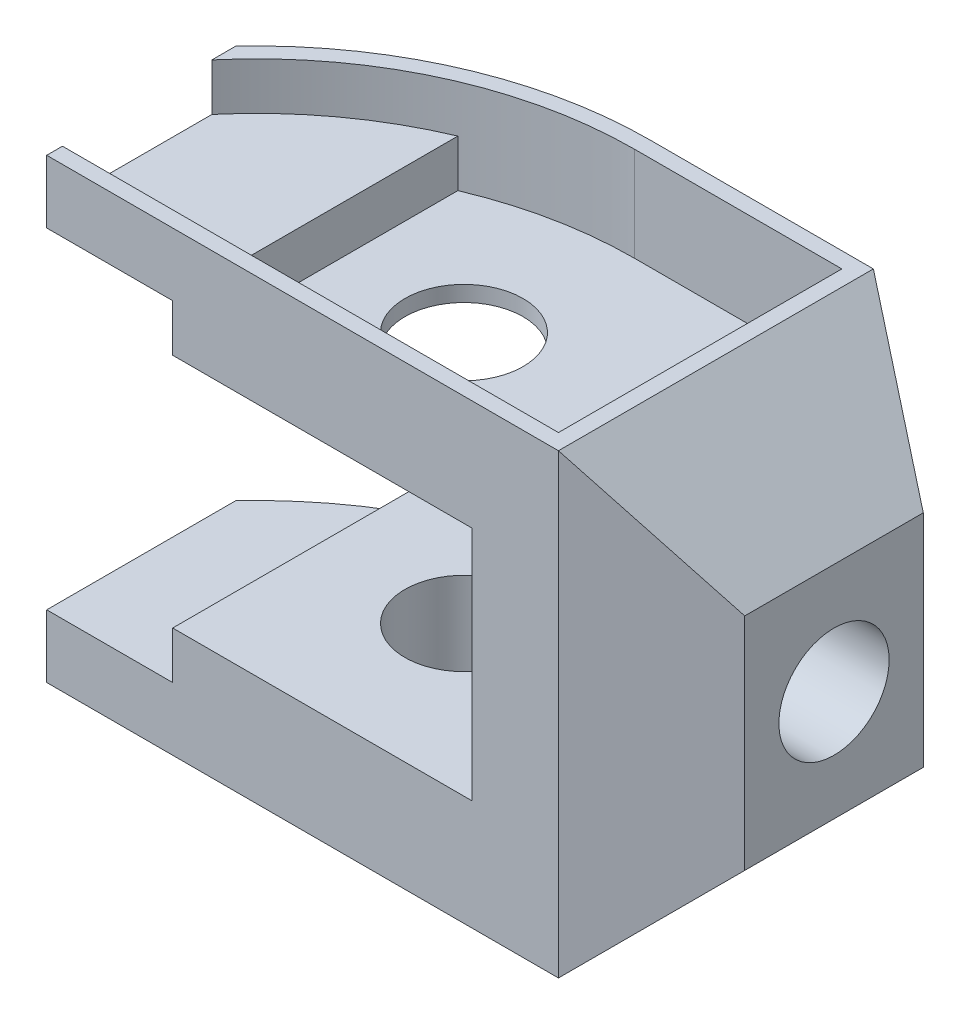
ISO-10303-21;
HEADER;
FILE_DESCRIPTION(('STEP AP214'),'2;1');
FILE_NAME('part.step','',(''),(''),'','','');
FILE_SCHEMA(('AUTOMOTIVE_DESIGN { 1 0 10303 214 1 1 1 1 }'));
ENDSEC;
DATA;
#1=APPLICATION_CONTEXT('core data for automotive mechanical design processes');
#2=APPLICATION_PROTOCOL_DEFINITION('international standard','automotive_design',2000,#1);
#3=PRODUCT_CONTEXT('',#1,'mechanical');
#4=PRODUCT('Part','Part','',(#3));
#5=PRODUCT_RELATED_PRODUCT_CATEGORY('part','',(#4));
#6=PRODUCT_DEFINITION_FORMATION('','',#4);
#7=PRODUCT_DEFINITION_CONTEXT('part definition',#1,'design');
#8=PRODUCT_DEFINITION('design','',#6,#7);
#9=PRODUCT_DEFINITION_SHAPE('','',#8);
#10=(LENGTH_UNIT() NAMED_UNIT(*) SI_UNIT(.MILLI.,.METRE.));
#11=(NAMED_UNIT(*) PLANE_ANGLE_UNIT() SI_UNIT($,.RADIAN.));
#12=(NAMED_UNIT(*) SI_UNIT($,.STERADIAN.) SOLID_ANGLE_UNIT());
#13=UNCERTAINTY_MEASURE_WITH_UNIT(LENGTH_MEASURE(1.E-05),#10,'distance_accuracy_value','');
#14=(GEOMETRIC_REPRESENTATION_CONTEXT(3) GLOBAL_UNCERTAINTY_ASSIGNED_CONTEXT((#13)) GLOBAL_UNIT_ASSIGNED_CONTEXT((#10,
#11,#12)) REPRESENTATION_CONTEXT('',''));
#15=CARTESIAN_POINT('',(0.,0.,0.));
#16=DIRECTION('',(0.,0.,1.));
#17=DIRECTION('',(1.,0.,0.));
#18=AXIS2_PLACEMENT_3D('',#15,#16,#17);
#19=CARTESIAN_POINT('',(34.,58.,-19.));
#20=DIRECTION('',(0.,-1.,0.));
#21=DIRECTION('',(0.,0.,-1.));
#22=AXIS2_PLACEMENT_3D('',#19,#20,#21);
#23=CYLINDRICAL_SURFACE('',#22,7.5);
#24=CARTESIAN_POINT('',(34.,44.,-19.));
#25=DIRECTION('',(0.,1.,0.));
#26=DIRECTION('',(0.,0.,1.));
#27=AXIS2_PLACEMENT_3D('',#24,#25,#26);
#28=CIRCLE('',#27,7.5);
#29=CARTESIAN_POINT('',(34.,44.,-26.5));
#30=VERTEX_POINT('',#29);
#31=EDGE_CURVE('E321',#30,#30,#28,.T.);
#32=CARTESIAN_POINT('',(34.,46.,-19.));
#33=DIRECTION('',(0.,1.,0.));
#34=DIRECTION('',(0.,0.,1.));
#35=AXIS2_PLACEMENT_3D('',#32,#33,#34);
#36=CIRCLE('',#35,7.5);
#37=CARTESIAN_POINT('',(34.,46.,-26.5));
#38=VERTEX_POINT('',#37);
#39=EDGE_CURVE('E50',#38,#38,#36,.T.);
#40=CARTESIAN_POINT('',(34.,44.,-26.5));
#41=CARTESIAN_POINT('',(34.,44.0208333333333,-26.5));
#42=CARTESIAN_POINT('',(34.,44.0416666666667,-26.5));
#43=CARTESIAN_POINT('',(34.,44.0833333333333,-26.5));
#44=CARTESIAN_POINT('',(34.,44.1041666666667,-26.5));
#45=CARTESIAN_POINT('',(34.,44.1458333333333,-26.5));
#46=CARTESIAN_POINT('',(34.,44.1666666666667,-26.5));
#47=CARTESIAN_POINT('',(34.,44.2083333333333,-26.5));
#48=CARTESIAN_POINT('',(34.,44.2291666666667,-26.5));
#49=CARTESIAN_POINT('',(34.,44.2708333333333,-26.5));
#50=CARTESIAN_POINT('',(34.,44.2916666666667,-26.5));
#51=CARTESIAN_POINT('',(34.,44.3333333333333,-26.5));
#52=CARTESIAN_POINT('',(34.,44.3541666666667,-26.5));
#53=CARTESIAN_POINT('',(34.,44.3958333333333,-26.5));
#54=CARTESIAN_POINT('',(34.,44.4166666666667,-26.5));
#55=CARTESIAN_POINT('',(34.,44.4583333333333,-26.5));
#56=CARTESIAN_POINT('',(34.,44.4791666666667,-26.5));
#57=CARTESIAN_POINT('',(34.,44.5208333333333,-26.5));
#58=CARTESIAN_POINT('',(34.,44.5416666666667,-26.5));
#59=CARTESIAN_POINT('',(34.,44.5833333333333,-26.5));
#60=CARTESIAN_POINT('',(34.,44.6041666666667,-26.5));
#61=CARTESIAN_POINT('',(34.,44.6458333333333,-26.5));
#62=CARTESIAN_POINT('',(34.,44.6666666666667,-26.5));
#63=CARTESIAN_POINT('',(34.,44.7083333333333,-26.5));
#64=CARTESIAN_POINT('',(34.,44.7291666666667,-26.5));
#65=CARTESIAN_POINT('',(34.,44.7708333333333,-26.5));
#66=CARTESIAN_POINT('',(34.,44.7916666666667,-26.5));
#67=CARTESIAN_POINT('',(34.,44.8333333333333,-26.5));
#68=CARTESIAN_POINT('',(34.,44.8541666666667,-26.5));
#69=CARTESIAN_POINT('',(34.,44.8958333333333,-26.5));
#70=CARTESIAN_POINT('',(34.,44.9166666666667,-26.5));
#71=CARTESIAN_POINT('',(34.,44.9583333333333,-26.5));
#72=CARTESIAN_POINT('',(34.,44.9791666666667,-26.5));
#73=CARTESIAN_POINT('',(34.,45.0208333333333,-26.5));
#74=CARTESIAN_POINT('',(34.,45.0416666666667,-26.5));
#75=CARTESIAN_POINT('',(34.,45.0833333333333,-26.5));
#76=CARTESIAN_POINT('',(34.,45.1041666666667,-26.5));
#77=CARTESIAN_POINT('',(34.,45.1458333333333,-26.5));
#78=CARTESIAN_POINT('',(34.,45.1666666666667,-26.5));
#79=CARTESIAN_POINT('',(34.,45.2083333333333,-26.5));
#80=CARTESIAN_POINT('',(34.,45.2291666666667,-26.5));
#81=CARTESIAN_POINT('',(34.,45.2708333333333,-26.5));
#82=CARTESIAN_POINT('',(34.,45.2916666666667,-26.5));
#83=CARTESIAN_POINT('',(34.,45.3333333333333,-26.5));
#84=CARTESIAN_POINT('',(34.,45.3541666666667,-26.5));
#85=CARTESIAN_POINT('',(34.,45.3958333333333,-26.5));
#86=CARTESIAN_POINT('',(34.,45.4166666666667,-26.5));
#87=CARTESIAN_POINT('',(34.,45.4583333333333,-26.5));
#88=CARTESIAN_POINT('',(34.,45.4791666666667,-26.5));
#89=CARTESIAN_POINT('',(34.,45.5208333333333,-26.5));
#90=CARTESIAN_POINT('',(34.,45.5416666666667,-26.5));
#91=CARTESIAN_POINT('',(34.,45.5833333333333,-26.5));
#92=CARTESIAN_POINT('',(34.,45.6041666666667,-26.5));
#93=CARTESIAN_POINT('',(34.,45.6458333333333,-26.5));
#94=CARTESIAN_POINT('',(34.,45.6666666666667,-26.5));
#95=CARTESIAN_POINT('',(34.,45.7083333333333,-26.5));
#96=CARTESIAN_POINT('',(34.,45.7291666666667,-26.5));
#97=CARTESIAN_POINT('',(34.,45.7708333333333,-26.5));
#98=CARTESIAN_POINT('',(34.,45.7916666666667,-26.5));
#99=CARTESIAN_POINT('',(34.,45.8333333333333,-26.5));
#100=CARTESIAN_POINT('',(34.,45.8541666666667,-26.5));
#101=CARTESIAN_POINT('',(34.,45.8958333333333,-26.5));
#102=CARTESIAN_POINT('',(34.,45.9166666666667,-26.5));
#103=CARTESIAN_POINT('',(34.,45.9583333333333,-26.5));
#104=CARTESIAN_POINT('',(34.,45.9791666666667,-26.5));
#105=CARTESIAN_POINT('',(34.,46.,-26.5));
#106=B_SPLINE_CURVE_WITH_KNOTS('',3,(#40,#41,#42,#43,#44,#45,#46,#47,#48,#49,#50,#51,#52,#53,
#54,#55,#56,#57,#58,#59,#60,#61,#62,#63,#64,#65,#66,#67,#68,#69,#70,#71,#72,#73,#74,#75,#76,#77,
#78,#79,#80,#81,#82,#83,#84,#85,#86,#87,#88,#89,#90,#91,#92,#93,#94,#95,#96,#97,#98,#99,#100,
#101,#102,#103,#104,#105),.UNSPECIFIED.,.F.,.F.,(4,2,2,2,2,2,2,2,2,2,2,2,2,2,2,2,2,2,2,2,2,2,2,
2,2,2,2,2,2,2,2,2,4),(0.,0.0625000000000001,0.125,0.1875,0.25,0.3125,0.375,0.4375,0.5,0.5625,
0.625000000000001,0.687500000000001,0.750000000000001,0.812500000000001,0.875000000000001,
0.937500000000001,1.,1.0625,1.125,1.1875,1.25,1.3125,1.375,1.4375,1.5,1.5625,1.625,1.6875,1.75,
1.8125,1.875,1.9375,2.),.UNSPECIFIED.);
#107=EDGE_CURVE('BSEAM46',#30,#38,#106,.T.);
#108=ORIENTED_EDGE('',*,*,#31,.F.);
#109=ORIENTED_EDGE('',*,*,#39,.T.);
#110=ORIENTED_EDGE('',*,*,#107,.T.);
#111=ORIENTED_EDGE('',*,*,#107,.F.);
#112=EDGE_LOOP('',(#108,#110,#109,#111));
#113=FACE_BOUND('',#112,.T.);
#114=ADVANCED_FACE('F46',(#113),#23,.F.);
#115=CARTESIAN_POINT('',(0.,58.,0.));
#116=DIRECTION('',(1.,0.,0.));
#117=DIRECTION('',(0.,0.,-1.));
#118=AXIS2_PLACEMENT_3D('',#115,#116,#117);
#119=PLANE('',#118);
#120=DIRECTION('',(0.,0.,1.));
#121=VECTOR('',#120,1.);
#122=CARTESIAN_POINT('',(0.,58.,0.));
#123=LINE('',#122,#121);
#124=CARTESIAN_POINT('',(0.,58.,-2.));
#125=VERTEX_POINT('',#124);
#126=CARTESIAN_POINT('',(0.,58.,0.));
#127=VERTEX_POINT('',#126);
#128=EDGE_CURVE('E333',#125,#127,#123,.T.);
#129=ORIENTED_EDGE('',*,*,#128,.F.);
#130=DIRECTION('',(0.,1.,0.));
#131=VECTOR('',#130,1.);
#132=CARTESIAN_POINT('',(0.,-22.5603197346869,-2.));
#133=LINE('',#132,#131);
#134=CARTESIAN_POINT('',(0.,52.,-2.));
#135=VERTEX_POINT('',#134);
#136=EDGE_CURVE('E226',#135,#125,#133,.T.);
#137=ORIENTED_EDGE('',*,*,#136,.F.);
#138=DIRECTION('',(0.,0.,-1.));
#139=VECTOR('',#138,1.);
#140=CARTESIAN_POINT('',(0.,52.,-2.));
#141=LINE('',#140,#139);
#142=CARTESIAN_POINT('',(0.,52.,-20.9838667696593));
#143=VERTEX_POINT('',#142);
#144=EDGE_CURVE('E225',#135,#143,#141,.T.);
#145=ORIENTED_EDGE('',*,*,#144,.T.);
#146=DIRECTION('',(0.,1.,0.));
#147=VECTOR('',#146,1.);
#148=CARTESIAN_POINT('',(0.,-22.5603197346869,-20.9838667696594));
#149=LINE('',#148,#147);
#150=CARTESIAN_POINT('',(0.,58.,-20.9838667696594));
#151=VERTEX_POINT('',#150);
#152=EDGE_CURVE('E223',#143,#151,#149,.T.);
#153=ORIENTED_EDGE('',*,*,#152,.T.);
#154=CARTESIAN_POINT('',(0.,58.,-24.));
#155=VERTEX_POINT('',#154);
#156=EDGE_CURVE('E329',#155,#151,#123,.T.);
#157=ORIENTED_EDGE('',*,*,#156,.F.);
#158=DIRECTION('',(0.,-1.,0.));
#159=VECTOR('',#158,1.);
#160=CARTESIAN_POINT('',(0.,58.,-24.));
#161=LINE('',#160,#159);
#162=CARTESIAN_POINT('',(0.,50.,-24.));
#163=VERTEX_POINT('',#162);
#164=EDGE_CURVE('E352',#155,#163,#161,.T.);
#165=ORIENTED_EDGE('',*,*,#164,.T.);
#166=DIRECTION('',(0.,0.,1.));
#167=VECTOR('',#166,1.);
#168=CARTESIAN_POINT('',(0.,50.,-40.));
#169=LINE('',#168,#167);
#170=CARTESIAN_POINT('',(0.,50.,0.));
#171=VERTEX_POINT('',#170);
#172=EDGE_CURVE('E301',#163,#171,#169,.T.);
#173=ORIENTED_EDGE('',*,*,#172,.T.);
#174=DIRECTION('',(0.,-1.,0.));
#175=VECTOR('',#174,1.);
#176=CARTESIAN_POINT('',(0.,58.,0.));
#177=LINE('',#176,#175);
#178=EDGE_CURVE('E372',#127,#171,#177,.T.);
#179=ORIENTED_EDGE('',*,*,#178,.F.);
#180=EDGE_LOOP('',(#129,#137,#145,#153,#157,#165,#173,#179));
#181=FACE_BOUND('',#180,.T.);
#182=ADVANCED_FACE('F415',(#181),#119,.F.);
#183=CARTESIAN_POINT('',(36.6606055596467,58.,10.));
#184=DIRECTION('',(0.,-1.,0.));
#185=DIRECTION('',(0.,0.,-1.));
#186=AXIS2_PLACEMENT_3D('',#183,#184,#185);
#187=CYLINDRICAL_SURFACE('',#186,50.);
#188=DIRECTION('',(0.,-1.,0.));
#189=VECTOR('',#188,1.);
#190=CARTESIAN_POINT('',(16.,58.,-35.5317403347236));
#191=LINE('',#190,#189);
#192=CARTESIAN_POINT('',(16.,44.,-35.5317403347236));
#193=VERTEX_POINT('',#192);
#194=CARTESIAN_POINT('',(16.,50.,-35.5317403347236));
#195=VERTEX_POINT('',#194);
#196=EDGE_CURVE('E385',#193,#195,#191,.F.);
#197=ORIENTED_EDGE('',*,*,#196,.T.);
#198=CARTESIAN_POINT('',(36.6606055596467,50.,10.));
#199=DIRECTION('',(0.,1.,0.));
#200=DIRECTION('',(0.,0.,1.));
#201=AXIS2_PLACEMENT_3D('',#198,#199,#200);
#202=CIRCLE('',#201,50.);
#203=EDGE_CURVE('E388',#195,#163,#202,.T.);
#204=ORIENTED_EDGE('',*,*,#203,.T.);
#205=ORIENTED_EDGE('',*,*,#164,.F.);
#206=CARTESIAN_POINT('',(36.6606055596467,58.,10.));
#207=DIRECTION('',(0.,1.,0.));
#208=DIRECTION('',(0.,0.,-1.));
#209=AXIS2_PLACEMENT_3D('',#206,#207,#208);
#210=CIRCLE('',#209,50.);
#211=CARTESIAN_POINT('',(36.6606055596467,58.,-40.));
#212=VERTEX_POINT('',#211);
#213=EDGE_CURVE('E338',#212,#155,#210,.T.);
#214=ORIENTED_EDGE('',*,*,#213,.F.);
#215=DIRECTION('',(0.,-1.,0.));
#216=VECTOR('',#215,1.);
#217=CARTESIAN_POINT('',(36.6606055596467,58.,-40.));
#218=LINE('',#217,#216);
#219=CARTESIAN_POINT('',(36.6606055596467,44.,-40.));
#220=VERTEX_POINT('',#219);
#221=EDGE_CURVE('E356',#212,#220,#218,.T.);
#222=ORIENTED_EDGE('',*,*,#221,.T.);
#223=CARTESIAN_POINT('',(36.6606055596467,44.,10.));
#224=DIRECTION('',(0.,1.,0.));
#225=DIRECTION('',(0.,0.,1.));
#226=AXIS2_PLACEMENT_3D('',#223,#224,#225);
#227=CIRCLE('',#226,50.);
#228=EDGE_CURVE('E322',#220,#193,#227,.T.);
#229=ORIENTED_EDGE('',*,*,#228,.T.);
#230=EDGE_LOOP('',(#197,#204,#205,#214,#222,#229));
#231=FACE_BOUND('',#230,.T.);
#232=ADVANCED_FACE('F422',(#231),#187,.T.);
#233=CARTESIAN_POINT('',(36.6606055596467,58.,10.));
#234=DIRECTION('',(0.,-1.,0.));
#235=DIRECTION('',(0.,0.,-1.));
#236=AXIS2_PLACEMENT_3D('',#233,#234,#235);
#237=PLANE('',#236);
#238=DIRECTION('',(0.,0.,-1.));
#239=VECTOR('',#238,1.);
#240=CARTESIAN_POINT('',(63.,58.,-2.));
#241=LINE('',#240,#239);
#242=CARTESIAN_POINT('',(63.,58.,-2.));
#243=VERTEX_POINT('',#242);
#244=CARTESIAN_POINT('',(63.,58.,-38.));
#245=VERTEX_POINT('',#244);
#246=EDGE_CURVE('E237',#243,#245,#241,.T.);
#247=ORIENTED_EDGE('',*,*,#246,.F.);
#248=DIRECTION('',(1.,0.,0.));
#249=VECTOR('',#248,1.);
#250=CARTESIAN_POINT('',(0.,58.,-2.));
#251=LINE('',#250,#249);
#252=EDGE_CURVE('E71',#125,#243,#251,.T.);
#253=ORIENTED_EDGE('',*,*,#252,.F.);
#254=ORIENTED_EDGE('',*,*,#128,.T.);
#255=DIRECTION('',(1.,0.,0.));
#256=VECTOR('',#255,1.);
#257=CARTESIAN_POINT('',(0.,58.,0.));
#258=LINE('',#257,#256);
#259=CARTESIAN_POINT('',(65.,58.,0.));
#260=VERTEX_POINT('',#259);
#261=EDGE_CURVE('E332',#127,#260,#258,.T.);
#262=ORIENTED_EDGE('',*,*,#261,.T.);
#263=DIRECTION('',(0.,0.,1.));
#264=VECTOR('',#263,1.);
#265=CARTESIAN_POINT('',(65.,58.,-40.));
#266=LINE('',#265,#264);
#267=CARTESIAN_POINT('',(65.,58.,-40.));
#268=VERTEX_POINT('',#267);
#269=EDGE_CURVE('E259',#268,#260,#266,.T.);
#270=ORIENTED_EDGE('',*,*,#269,.F.);
#271=DIRECTION('',(-1.,0.,0.));
#272=VECTOR('',#271,1.);
#273=CARTESIAN_POINT('',(65.,58.,-40.));
#274=LINE('',#273,#272);
#275=EDGE_CURVE('E336',#268,#212,#274,.T.);
#276=ORIENTED_EDGE('',*,*,#275,.T.);
#277=ORIENTED_EDGE('',*,*,#213,.T.);
#278=ORIENTED_EDGE('',*,*,#156,.T.);
#279=CARTESIAN_POINT('',(36.6606055596467,58.,10.));
#280=DIRECTION('',(0.,1.,0.));
#281=DIRECTION('',(0.,0.,1.));
#282=AXIS2_PLACEMENT_3D('',#279,#280,#281);
#283=CIRCLE('',#282,48.);
#284=CARTESIAN_POINT('',(36.6606055596467,58.,-38.));
#285=VERTEX_POINT('',#284);
#286=EDGE_CURVE('E243',#285,#151,#283,.T.);
#287=ORIENTED_EDGE('',*,*,#286,.F.);
#288=DIRECTION('',(-1.,0.,0.));
#289=VECTOR('',#288,1.);
#290=CARTESIAN_POINT('',(63.,58.,-38.));
#291=LINE('',#290,#289);
#292=EDGE_CURVE('E240',#245,#285,#291,.T.);
#293=ORIENTED_EDGE('',*,*,#292,.F.);
#294=EDGE_LOOP('',(#247,#253,#254,#262,#270,#276,#277,#278,#287,#293));
#295=FACE_BOUND('',#294,.T.);
#296=ADVANCED_FACE('F448',(#295),#237,.F.);
#297=CARTESIAN_POINT('',(36.6606055596467,0.,10.));
#298=DIRECTION('',(0.,-1.,0.));
#299=DIRECTION('',(0.,0.,-1.));
#300=AXIS2_PLACEMENT_3D('',#297,#298,#299);
#301=PLANE('',#300);
#302=DIRECTION('',(0.,0.,1.));
#303=VECTOR('',#302,1.);
#304=CARTESIAN_POINT('',(65.,0.,-40.));
#305=LINE('',#304,#303);
#306=CARTESIAN_POINT('',(65.,0.,-40.));
#307=VERTEX_POINT('',#306);
#308=CARTESIAN_POINT('',(65.,0.,0.));
#309=VERTEX_POINT('',#308);
#310=EDGE_CURVE('E261',#307,#309,#305,.T.);
#311=ORIENTED_EDGE('',*,*,#310,.T.);
#312=DIRECTION('',(1.,0.,0.));
#313=VECTOR('',#312,1.);
#314=CARTESIAN_POINT('',(0.,0.,0.));
#315=LINE('',#314,#313);
#316=CARTESIAN_POINT('',(0.,0.,0.));
#317=VERTEX_POINT('',#316);
#318=EDGE_CURVE('E343',#317,#309,#315,.T.);
#319=ORIENTED_EDGE('',*,*,#318,.F.);
#320=DIRECTION('',(0.,0.,1.));
#321=VECTOR('',#320,1.);
#322=CARTESIAN_POINT('',(0.,0.,0.));
#323=LINE('',#322,#321);
#324=CARTESIAN_POINT('',(0.,0.,-24.));
#325=VERTEX_POINT('',#324);
#326=EDGE_CURVE('E328',#325,#317,#323,.T.);
#327=ORIENTED_EDGE('',*,*,#326,.F.);
#328=CARTESIAN_POINT('',(36.6606055596467,0.,10.));
#329=DIRECTION('',(0.,1.,0.));
#330=DIRECTION('',(0.,0.,-1.));
#331=AXIS2_PLACEMENT_3D('',#328,#329,#330);
#332=CIRCLE('',#331,50.);
#333=CARTESIAN_POINT('',(36.6606055596467,0.,-40.));
#334=VERTEX_POINT('',#333);
#335=EDGE_CURVE('E349',#334,#325,#332,.T.);
#336=ORIENTED_EDGE('',*,*,#335,.F.);
#337=DIRECTION('',(-1.,0.,0.));
#338=VECTOR('',#337,1.);
#339=CARTESIAN_POINT('',(65.,0.,-40.));
#340=LINE('',#339,#338);
#341=EDGE_CURVE('E346',#307,#334,#340,.T.);
#342=ORIENTED_EDGE('',*,*,#341,.F.);
#343=EDGE_LOOP('',(#311,#319,#327,#336,#342));
#344=FACE_BOUND('',#343,.T.);
#345=CARTESIAN_POINT('',(34.,0.,-19.));
#346=DIRECTION('',(0.,1.,0.));
#347=DIRECTION('',(0.,0.,1.));
#348=AXIS2_PLACEMENT_3D('',#345,#346,#347);
#349=CIRCLE('',#348,7.5);
#350=CARTESIAN_POINT('',(34.,0.,-26.5));
#351=VERTEX_POINT('',#350);
#352=EDGE_CURVE('E325',#351,#351,#349,.T.);
#353=ORIENTED_EDGE('',*,*,#352,.T.);
#354=EDGE_LOOP('',(#353));
#355=FACE_BOUND('',#354,.T.);
#356=ADVANCED_FACE('F446',(#344,#355),#301,.T.);
#357=CARTESIAN_POINT('',(0.,8.,0.));
#358=VERTEX_POINT('',#357);
#359=EDGE_CURVE('E371',#358,#317,#177,.T.);
#360=ORIENTED_EDGE('',*,*,#359,.F.);
#361=DIRECTION('',(0.,0.,1.));
#362=VECTOR('',#361,1.);
#363=CARTESIAN_POINT('',(0.,8.,-40.));
#364=LINE('',#363,#362);
#365=CARTESIAN_POINT('',(0.,8.,-24.));
#366=VERTEX_POINT('',#365);
#367=EDGE_CURVE('E282',#366,#358,#364,.T.);
#368=ORIENTED_EDGE('',*,*,#367,.F.);
#369=EDGE_CURVE('E340',#366,#325,#161,.T.);
#370=ORIENTED_EDGE('',*,*,#369,.T.);
#371=ORIENTED_EDGE('',*,*,#326,.T.);
#372=EDGE_LOOP('',(#360,#368,#370,#371));
#373=FACE_BOUND('',#372,.T.);
#374=ADVANCED_FACE('F48',(#373),#119,.F.);
#375=CARTESIAN_POINT('',(0.,58.,0.));
#376=DIRECTION('',(0.,0.,-1.));
#377=DIRECTION('',(-1.,0.,0.));
#378=AXIS2_PLACEMENT_3D('',#375,#376,#377);
#379=PLANE('',#378);
#380=ORIENTED_EDGE('',*,*,#178,.T.);
#381=DIRECTION('',(-1.,0.,0.));
#382=VECTOR('',#381,1.);
#383=CARTESIAN_POINT('',(0.,50.,0.));
#384=LINE('',#383,#382);
#385=CARTESIAN_POINT('',(16.,50.,0.));
#386=VERTEX_POINT('',#385);
#387=EDGE_CURVE('E276',#386,#171,#384,.T.);
#388=ORIENTED_EDGE('',*,*,#387,.F.);
#389=DIRECTION('',(0.,1.,0.));
#390=VECTOR('',#389,1.);
#391=CARTESIAN_POINT('',(16.,50.,0.));
#392=LINE('',#391,#390);
#393=CARTESIAN_POINT('',(16.,44.,0.));
#394=VERTEX_POINT('',#393);
#395=EDGE_CURVE('E297',#394,#386,#392,.T.);
#396=ORIENTED_EDGE('',*,*,#395,.F.);
#397=DIRECTION('',(-1.,0.,0.));
#398=VECTOR('',#397,1.);
#399=CARTESIAN_POINT('',(16.,44.,0.));
#400=LINE('',#399,#398);
#401=CARTESIAN_POINT('',(54.,44.,0.));
#402=VERTEX_POINT('',#401);
#403=EDGE_CURVE('E294',#402,#394,#400,.T.);
#404=ORIENTED_EDGE('',*,*,#403,.F.);
#405=DIRECTION('',(0.,1.,0.));
#406=VECTOR('',#405,1.);
#407=CARTESIAN_POINT('',(54.,44.,0.));
#408=LINE('',#407,#406);
#409=CARTESIAN_POINT('',(54.,14.,0.));
#410=VERTEX_POINT('',#409);
#411=EDGE_CURVE('E291',#410,#402,#408,.T.);
#412=ORIENTED_EDGE('',*,*,#411,.F.);
#413=DIRECTION('',(1.,0.,0.));
#414=VECTOR('',#413,1.);
#415=CARTESIAN_POINT('',(54.,14.,0.));
#416=LINE('',#415,#414);
#417=CARTESIAN_POINT('',(16.,14.,0.));
#418=VERTEX_POINT('',#417);
#419=EDGE_CURVE('E288',#418,#410,#416,.T.);
#420=ORIENTED_EDGE('',*,*,#419,.F.);
#421=DIRECTION('',(0.,1.,0.));
#422=VECTOR('',#421,1.);
#423=CARTESIAN_POINT('',(16.,14.,0.));
#424=LINE('',#423,#422);
#425=CARTESIAN_POINT('',(16.,8.,0.));
#426=VERTEX_POINT('',#425);
#427=EDGE_CURVE('E285',#426,#418,#424,.T.);
#428=ORIENTED_EDGE('',*,*,#427,.F.);
#429=DIRECTION('',(1.,0.,0.));
#430=VECTOR('',#429,1.);
#431=CARTESIAN_POINT('',(16.,8.,0.));
#432=LINE('',#431,#430);
#433=EDGE_CURVE('E271',#358,#426,#432,.T.);
#434=ORIENTED_EDGE('',*,*,#433,.F.);
#435=ORIENTED_EDGE('',*,*,#359,.T.);
#436=ORIENTED_EDGE('',*,*,#318,.T.);
#437=DIRECTION('',(0.,-1.,0.));
#438=VECTOR('',#437,1.);
#439=CARTESIAN_POINT('',(65.,58.,0.));
#440=LINE('',#439,#438);
#441=EDGE_CURVE('E368',#260,#309,#440,.T.);
#442=ORIENTED_EDGE('',*,*,#441,.F.);
#443=ORIENTED_EDGE('',*,*,#261,.F.);
#444=EDGE_LOOP('',(#380,#388,#396,#404,#412,#420,#428,#434,#435,#436,#442,#443));
#445=FACE_BOUND('',#444,.T.);
#446=ADVANCED_FACE('F456',(#445),#379,.F.);
#447=CARTESIAN_POINT('',(65.,58.,0.));
#448=DIRECTION('',(-0.500000000000001,0.,-0.866025403784438));
#449=DIRECTION('',(-0.866025403784438,0.,0.500000000000001));
#450=AXIS2_PLACEMENT_3D('',#447,#448,#449);
#451=PLANE('',#450);
#452=DIRECTION('',(0.,-1.,0.));
#453=VECTOR('',#452,1.);
#454=CARTESIAN_POINT('',(80.,58.,-8.66025403784441));
#455=LINE('',#454,#453);
#456=CARTESIAN_POINT('',(80.,43.0000000000002,-8.66025403784441));
#457=VERTEX_POINT('',#456);
#458=CARTESIAN_POINT('',(80.,14.9999999999998,-8.66025403784441));
#459=VERTEX_POINT('',#458);
#460=EDGE_CURVE('E365',#457,#459,#455,.T.);
#461=ORIENTED_EDGE('',*,*,#460,.F.);
#462=DIRECTION('',(-0.65465367070798,0.654653670707973,0.37796447300923));
#463=VECTOR('',#462,1.);
#464=CARTESIAN_POINT('',(65.,58.,0.));
#465=LINE('',#464,#463);
#466=EDGE_CURVE('E268',#457,#260,#465,.T.);
#467=ORIENTED_EDGE('',*,*,#466,.T.);
#468=ORIENTED_EDGE('',*,*,#441,.T.);
#469=DIRECTION('',(0.65465367070798,0.654653670707973,-0.37796447300923));
#470=VECTOR('',#469,1.);
#471=CARTESIAN_POINT('',(89.8571428571428,24.8571428571425,-14.3512781198564));
#472=LINE('',#471,#470);
#473=EDGE_CURVE('E258',#309,#459,#472,.T.);
#474=ORIENTED_EDGE('',*,*,#473,.T.);
#475=EDGE_LOOP('',(#461,#467,#468,#474));
#476=FACE_BOUND('',#475,.T.);
#477=ADVANCED_FACE('F470',(#476),#451,.F.);
#478=CARTESIAN_POINT('',(80.,58.,-8.66025403784441));
#479=DIRECTION('',(-1.,0.,0.));
#480=DIRECTION('',(0.,0.,1.));
#481=AXIS2_PLACEMENT_3D('',#478,#479,#480);
#482=PLANE('',#481);
#483=CARTESIAN_POINT('',(80.,29.,-20.));
#484=DIRECTION('',(1.,0.,0.));
#485=DIRECTION('',(0.,0.,-1.));
#486=AXIS2_PLACEMENT_3D('',#483,#484,#485);
#487=CIRCLE('',#486,7.);
#488=CARTESIAN_POINT('',(80.,29.,-27.));
#489=VERTEX_POINT('',#488);
#490=EDGE_CURVE('E235',#489,#489,#487,.T.);
#491=ORIENTED_EDGE('',*,*,#490,.F.);
#492=EDGE_LOOP('',(#491));
#493=FACE_BOUND('',#492,.T.);
#494=DIRECTION('',(0.,-1.,0.));
#495=VECTOR('',#494,1.);
#496=CARTESIAN_POINT('',(80.,58.,-31.3397459621556));
#497=LINE('',#496,#495);
#498=CARTESIAN_POINT('',(80.,43.0000000000002,-31.3397459621556));
#499=VERTEX_POINT('',#498);
#500=CARTESIAN_POINT('',(80.,14.9999999999998,-31.3397459621556));
#501=VERTEX_POINT('',#500);
#502=EDGE_CURVE('E362',#499,#501,#497,.T.);
#503=ORIENTED_EDGE('',*,*,#502,.F.);
#504=DIRECTION('',(0.,0.,1.));
#505=VECTOR('',#504,1.);
#506=CARTESIAN_POINT('',(80.,43.0000000000002,-40.));
#507=LINE('',#506,#505);
#508=EDGE_CURVE('E255',#499,#457,#507,.T.);
#509=ORIENTED_EDGE('',*,*,#508,.T.);
#510=ORIENTED_EDGE('',*,*,#460,.T.);
#511=DIRECTION('',(0.,0.,1.));
#512=VECTOR('',#511,1.);
#513=CARTESIAN_POINT('',(80.,14.9999999999998,-40.));
#514=LINE('',#513,#512);
#515=EDGE_CURVE('E264',#501,#459,#514,.T.);
#516=ORIENTED_EDGE('',*,*,#515,.F.);
#517=EDGE_LOOP('',(#503,#509,#510,#516));
#518=FACE_BOUND('',#517,.T.);
#519=ADVANCED_FACE('F466',(#493,#518),#482,.F.);
#520=CARTESIAN_POINT('',(80.,58.,-31.3397459621556));
#521=DIRECTION('',(-0.500000000000001,0.,0.866025403784438));
#522=DIRECTION('',(0.866025403784438,0.,0.500000000000001));
#523=AXIS2_PLACEMENT_3D('',#520,#521,#522);
#524=PLANE('',#523);
#525=DIRECTION('',(0.,-1.,0.));
#526=VECTOR('',#525,1.);
#527=CARTESIAN_POINT('',(65.,58.,-40.));
#528=LINE('',#527,#526);
#529=EDGE_CURVE('E359',#268,#307,#528,.T.);
#530=ORIENTED_EDGE('',*,*,#529,.F.);
#531=DIRECTION('',(0.65465367070798,-0.654653670707973,0.37796447300923));
#532=VECTOR('',#531,1.);
#533=CARTESIAN_POINT('',(73.5714285714287,49.4285714285714,-35.051283406946));
#534=LINE('',#533,#532);
#535=EDGE_CURVE('E13',#268,#499,#534,.T.);
#536=ORIENTED_EDGE('',*,*,#535,.T.);
#537=ORIENTED_EDGE('',*,*,#502,.T.);
#538=DIRECTION('',(-0.65465367070798,-0.654653670707973,-0.37796447300923));
#539=VECTOR('',#538,1.);
#540=CARTESIAN_POINT('',(98.4285714285714,33.4285714285711,-20.7000052870896));
#541=LINE('',#540,#539);
#542=EDGE_CURVE('E55',#501,#307,#541,.T.);
#543=ORIENTED_EDGE('',*,*,#542,.T.);
#544=EDGE_LOOP('',(#530,#536,#537,#543));
#545=FACE_BOUND('',#544,.T.);
#546=ADVANCED_FACE('F462',(#545),#524,.F.);
#547=CARTESIAN_POINT('',(65.,58.,-40.));
#548=DIRECTION('',(0.,0.,1.));
#549=DIRECTION('',(1.,0.,0.));
#550=AXIS2_PLACEMENT_3D('',#547,#548,#549);
#551=PLANE('',#550);
#552=DIRECTION('',(0.,1.,0.));
#553=VECTOR('',#552,1.);
#554=CARTESIAN_POINT('',(54.,44.,-40.));
#555=LINE('',#554,#553);
#556=CARTESIAN_POINT('',(54.,14.,-40.));
#557=VERTEX_POINT('',#556);
#558=CARTESIAN_POINT('',(54.,44.,-40.));
#559=VERTEX_POINT('',#558);
#560=EDGE_CURVE('E275',#557,#559,#555,.T.);
#561=ORIENTED_EDGE('',*,*,#560,.T.);
#562=DIRECTION('',(-1.,0.,0.));
#563=VECTOR('',#562,1.);
#564=CARTESIAN_POINT('',(16.,44.,-40.));
#565=LINE('',#564,#563);
#566=EDGE_CURVE('E279',#559,#220,#565,.T.);
#567=ORIENTED_EDGE('',*,*,#566,.T.);
#568=ORIENTED_EDGE('',*,*,#221,.F.);
#569=ORIENTED_EDGE('',*,*,#275,.F.);
#570=ORIENTED_EDGE('',*,*,#529,.T.);
#571=ORIENTED_EDGE('',*,*,#341,.T.);
#572=CARTESIAN_POINT('',(36.6606055596467,14.,-40.));
#573=VERTEX_POINT('',#572);
#574=EDGE_CURVE('E355',#573,#334,#218,.T.);
#575=ORIENTED_EDGE('',*,*,#574,.F.);
#576=DIRECTION('',(1.,0.,0.));
#577=VECTOR('',#576,1.);
#578=CARTESIAN_POINT('',(54.,14.,-40.));
#579=LINE('',#578,#577);
#580=EDGE_CURVE('E272',#573,#557,#579,.T.);
#581=ORIENTED_EDGE('',*,*,#580,.T.);
#582=EDGE_LOOP('',(#561,#567,#568,#569,#570,#571,#575,#581));
#583=FACE_BOUND('',#582,.T.);
#584=ADVANCED_FACE('F439',(#583),#551,.F.);
#585=DIRECTION('',(0.,-1.,0.));
#586=VECTOR('',#585,1.);
#587=CARTESIAN_POINT('',(16.,58.,-35.5317403347236));
#588=LINE('',#587,#586);
#589=CARTESIAN_POINT('',(16.,8.,-35.5317403347236));
#590=VERTEX_POINT('',#589);
#591=CARTESIAN_POINT('',(16.,14.,-35.5317403347236));
#592=VERTEX_POINT('',#591);
#593=EDGE_CURVE('E382',#590,#592,#588,.F.);
#594=ORIENTED_EDGE('',*,*,#593,.T.);
#595=CARTESIAN_POINT('',(36.6606055596467,14.,10.));
#596=DIRECTION('',(0.,-1.,0.));
#597=DIRECTION('',(1.,0.,0.));
#598=AXIS2_PLACEMENT_3D('',#595,#596,#597);
#599=CIRCLE('',#598,50.);
#600=EDGE_CURVE('E318',#592,#573,#599,.T.);
#601=ORIENTED_EDGE('',*,*,#600,.T.);
#602=ORIENTED_EDGE('',*,*,#574,.T.);
#603=ORIENTED_EDGE('',*,*,#335,.T.);
#604=ORIENTED_EDGE('',*,*,#369,.F.);
#605=CARTESIAN_POINT('',(36.6606055596467,8.,10.));
#606=DIRECTION('',(0.,-1.,0.));
#607=DIRECTION('',(0.,0.,-1.));
#608=AXIS2_PLACEMENT_3D('',#605,#606,#607);
#609=CIRCLE('',#608,50.);
#610=EDGE_CURVE('E375',#366,#590,#609,.T.);
#611=ORIENTED_EDGE('',*,*,#610,.T.);
#612=EDGE_LOOP('',(#594,#601,#602,#603,#604,#611));
#613=FACE_BOUND('',#612,.T.);
#614=ADVANCED_FACE('F430',(#613),#187,.T.);
#615=CARTESIAN_POINT('',(34.,14.,-19.));
#616=DIRECTION('',(0.,-1.,0.));
#617=DIRECTION('',(1.,0.,0.));
#618=AXIS2_PLACEMENT_3D('',#615,#616,#617);
#619=CIRCLE('',#618,7.5);
#620=CARTESIAN_POINT('',(34.,14.,-26.5));
#621=VERTEX_POINT('',#620);
#622=EDGE_CURVE('E304',#621,#621,#619,.T.);
#623=CARTESIAN_POINT('',(34.,14.,-26.5));
#624=CARTESIAN_POINT('',(34.,13.8541666666667,-26.5));
#625=CARTESIAN_POINT('',(34.,13.7083333333333,-26.5));
#626=CARTESIAN_POINT('',(34.,13.4166666666667,-26.5));
#627=CARTESIAN_POINT('',(34.,13.2708333333333,-26.5));
#628=CARTESIAN_POINT('',(34.,12.9791666666667,-26.5));
#629=CARTESIAN_POINT('',(34.,12.8333333333333,-26.5));
#630=CARTESIAN_POINT('',(34.,12.5416666666667,-26.5));
#631=CARTESIAN_POINT('',(34.,12.3958333333333,-26.5));
#632=CARTESIAN_POINT('',(34.,12.1041666666667,-26.5));
#633=CARTESIAN_POINT('',(34.,11.9583333333333,-26.5));
#634=CARTESIAN_POINT('',(34.,11.6666666666667,-26.5));
#635=CARTESIAN_POINT('',(34.,11.5208333333333,-26.5));
#636=CARTESIAN_POINT('',(34.,11.2291666666667,-26.5));
#637=CARTESIAN_POINT('',(34.,11.0833333333333,-26.5));
#638=CARTESIAN_POINT('',(34.,10.7916666666667,-26.5));
#639=CARTESIAN_POINT('',(34.,10.6458333333333,-26.5));
#640=CARTESIAN_POINT('',(34.,10.3541666666667,-26.5));
#641=CARTESIAN_POINT('',(34.,10.2083333333333,-26.5));
#642=CARTESIAN_POINT('',(34.,9.91666666666667,-26.5));
#643=CARTESIAN_POINT('',(34.,9.77083333333333,-26.5));
#644=CARTESIAN_POINT('',(34.,9.47916666666667,-26.5));
#645=CARTESIAN_POINT('',(34.,9.33333333333333,-26.5));
#646=CARTESIAN_POINT('',(34.,9.04166666666667,-26.5));
#647=CARTESIAN_POINT('',(34.,8.89583333333333,-26.5));
#648=CARTESIAN_POINT('',(34.,8.60416666666667,-26.5));
#649=CARTESIAN_POINT('',(34.,8.45833333333333,-26.5));
#650=CARTESIAN_POINT('',(34.,8.16666666666667,-26.5));
#651=CARTESIAN_POINT('',(34.,8.02083333333333,-26.5));
#652=CARTESIAN_POINT('',(34.,7.72916666666667,-26.5));
#653=CARTESIAN_POINT('',(34.,7.58333333333333,-26.5));
#654=CARTESIAN_POINT('',(34.,7.29166666666667,-26.5));
#655=CARTESIAN_POINT('',(34.,7.14583333333333,-26.5));
#656=CARTESIAN_POINT('',(34.,6.85416666666667,-26.5));
#657=CARTESIAN_POINT('',(34.,6.70833333333333,-26.5));
#658=CARTESIAN_POINT('',(34.,6.41666666666667,-26.5));
#659=CARTESIAN_POINT('',(34.,6.27083333333333,-26.5));
#660=CARTESIAN_POINT('',(34.,5.97916666666667,-26.5));
#661=CARTESIAN_POINT('',(34.,5.83333333333333,-26.5));
#662=CARTESIAN_POINT('',(34.,5.54166666666666,-26.5));
#663=CARTESIAN_POINT('',(34.,5.39583333333333,-26.5));
#664=CARTESIAN_POINT('',(34.,5.10416666666666,-26.5));
#665=CARTESIAN_POINT('',(34.,4.95833333333333,-26.5));
#666=CARTESIAN_POINT('',(34.,4.66666666666667,-26.5));
#667=CARTESIAN_POINT('',(34.,4.52083333333333,-26.5));
#668=CARTESIAN_POINT('',(34.,4.22916666666667,-26.5));
#669=CARTESIAN_POINT('',(34.,4.08333333333333,-26.5));
#670=CARTESIAN_POINT('',(34.,3.79166666666667,-26.5));
#671=CARTESIAN_POINT('',(34.,3.64583333333333,-26.5));
#672=CARTESIAN_POINT('',(34.,3.35416666666667,-26.5));
#673=CARTESIAN_POINT('',(34.,3.20833333333333,-26.5));
#674=CARTESIAN_POINT('',(34.,2.91666666666666,-26.5));
#675=CARTESIAN_POINT('',(34.,2.77083333333333,-26.5));
#676=CARTESIAN_POINT('',(34.,2.47916666666667,-26.5));
#677=CARTESIAN_POINT('',(34.,2.33333333333334,-26.5));
#678=CARTESIAN_POINT('',(34.,2.04166666666667,-26.5));
#679=CARTESIAN_POINT('',(34.,1.89583333333333,-26.5));
#680=CARTESIAN_POINT('',(34.,1.60416666666667,-26.5));
#681=CARTESIAN_POINT('',(34.,1.45833333333333,-26.5));
#682=CARTESIAN_POINT('',(34.,1.16666666666667,-26.5));
#683=CARTESIAN_POINT('',(34.,1.02083333333333,-26.5));
#684=CARTESIAN_POINT('',(34.,0.729166666666667,-26.5));
#685=CARTESIAN_POINT('',(34.,0.583333333333334,-26.5));
#686=CARTESIAN_POINT('',(34.,0.291666666666667,-26.5));
#687=CARTESIAN_POINT('',(34.,0.145833333333333,-26.5));
#688=CARTESIAN_POINT('',(34.,0.,-26.5));
#689=B_SPLINE_CURVE_WITH_KNOTS('',3,(#623,#624,#625,#626,#627,#628,#629,#630,#631,#632,#633,
#634,#635,#636,#637,#638,#639,#640,#641,#642,#643,#644,#645,#646,#647,#648,#649,#650,#651,#652,
#653,#654,#655,#656,#657,#658,#659,#660,#661,#662,#663,#664,#665,#666,#667,#668,#669,#670,#671,
#672,#673,#674,#675,#676,#677,#678,#679,#680,#681,#682,#683,#684,#685,#686,#687,#688),
.UNSPECIFIED.,.F.,.F.,(4,2,2,2,2,2,2,2,2,2,2,2,2,2,2,2,2,2,2,2,2,2,2,2,2,2,2,2,2,2,2,2,4),(0.,
0.4375,0.875000000000001,1.3125,1.75,2.1875,2.625,3.0625,3.5,3.9375,4.375,4.8125,5.25,5.6875,
6.125,6.5625,7.,7.4375,7.875,8.3125,8.75,9.1875,9.62499999999999,10.0625,10.5,10.9375,11.375,
11.8125,12.25,12.6875,13.125,13.5625,14.),.UNSPECIFIED.);
#690=EDGE_CURVE('BSEAM418',#621,#351,#689,.T.);
#691=ORIENTED_EDGE('',*,*,#622,.F.);
#692=ORIENTED_EDGE('',*,*,#352,.F.);
#693=ORIENTED_EDGE('',*,*,#690,.T.);
#694=ORIENTED_EDGE('',*,*,#690,.F.);
#695=EDGE_LOOP('',(#691,#693,#692,#694));
#696=FACE_BOUND('',#695,.T.);
#697=ADVANCED_FACE('F418',(#696),#23,.F.);
#698=CARTESIAN_POINT('',(0.,50.,-40.));
#699=DIRECTION('',(0.,1.,0.));
#700=DIRECTION('',(0.,0.,1.));
#701=AXIS2_PLACEMENT_3D('',#698,#699,#700);
#702=PLANE('',#701);
#703=DIRECTION('',(0.,0.,1.));
#704=VECTOR('',#703,1.);
#705=CARTESIAN_POINT('',(16.,50.,-40.));
#706=LINE('',#705,#704);
#707=EDGE_CURVE('E305',#195,#386,#706,.T.);
#708=ORIENTED_EDGE('',*,*,#707,.T.);
#709=ORIENTED_EDGE('',*,*,#387,.T.);
#710=ORIENTED_EDGE('',*,*,#172,.F.);
#711=ORIENTED_EDGE('',*,*,#203,.F.);
#712=EDGE_LOOP('',(#708,#709,#710,#711));
#713=FACE_BOUND('',#712,.T.);
#714=ADVANCED_FACE('F429',(#713),#702,.F.);
#715=CARTESIAN_POINT('',(16.,50.,-40.));
#716=DIRECTION('',(1.,0.,0.));
#717=DIRECTION('',(0.,0.,-1.));
#718=AXIS2_PLACEMENT_3D('',#715,#716,#717);
#719=PLANE('',#718);
#720=DIRECTION('',(0.,0.,1.));
#721=VECTOR('',#720,1.);
#722=CARTESIAN_POINT('',(16.,44.,-40.));
#723=LINE('',#722,#721);
#724=EDGE_CURVE('E307',#193,#394,#723,.T.);
#725=ORIENTED_EDGE('',*,*,#724,.T.);
#726=ORIENTED_EDGE('',*,*,#395,.T.);
#727=ORIENTED_EDGE('',*,*,#707,.F.);
#728=ORIENTED_EDGE('',*,*,#196,.F.);
#729=EDGE_LOOP('',(#725,#726,#727,#728));
#730=FACE_BOUND('',#729,.T.);
#731=ADVANCED_FACE('F436',(#730),#719,.F.);
#732=CARTESIAN_POINT('',(16.,14.,-40.));
#733=DIRECTION('',(1.,0.,0.));
#734=DIRECTION('',(0.,0.,-1.));
#735=AXIS2_PLACEMENT_3D('',#732,#733,#734);
#736=PLANE('',#735);
#737=DIRECTION('',(0.,0.,1.));
#738=VECTOR('',#737,1.);
#739=CARTESIAN_POINT('',(16.,8.,-40.));
#740=LINE('',#739,#738);
#741=EDGE_CURVE('E315',#590,#426,#740,.T.);
#742=ORIENTED_EDGE('',*,*,#741,.T.);
#743=ORIENTED_EDGE('',*,*,#427,.T.);
#744=DIRECTION('',(0.,0.,1.));
#745=VECTOR('',#744,1.);
#746=CARTESIAN_POINT('',(16.,14.,-40.));
#747=LINE('',#746,#745);
#748=EDGE_CURVE('E313',#592,#418,#747,.T.);
#749=ORIENTED_EDGE('',*,*,#748,.F.);
#750=ORIENTED_EDGE('',*,*,#593,.F.);
#751=EDGE_LOOP('',(#742,#743,#749,#750));
#752=FACE_BOUND('',#751,.T.);
#753=ADVANCED_FACE('F504',(#752),#736,.F.);
#754=CARTESIAN_POINT('',(16.,8.,-40.));
#755=DIRECTION('',(0.,-1.,0.));
#756=DIRECTION('',(0.,0.,-1.));
#757=AXIS2_PLACEMENT_3D('',#754,#755,#756);
#758=PLANE('',#757);
#759=ORIENTED_EDGE('',*,*,#367,.T.);
#760=ORIENTED_EDGE('',*,*,#433,.T.);
#761=ORIENTED_EDGE('',*,*,#741,.F.);
#762=ORIENTED_EDGE('',*,*,#610,.F.);
#763=EDGE_LOOP('',(#759,#760,#761,#762));
#764=FACE_BOUND('',#763,.T.);
#765=ADVANCED_FACE('F540',(#764),#758,.F.);
#766=CARTESIAN_POINT('',(16.,44.,-40.));
#767=DIRECTION('',(0.,1.,0.));
#768=DIRECTION('',(0.,0.,1.));
#769=AXIS2_PLACEMENT_3D('',#766,#767,#768);
#770=PLANE('',#769);
#771=ORIENTED_EDGE('',*,*,#31,.T.);
#772=EDGE_LOOP('',(#771));
#773=FACE_BOUND('',#772,.T.);
#774=ORIENTED_EDGE('',*,*,#566,.F.);
#775=DIRECTION('',(0.,0.,1.));
#776=VECTOR('',#775,1.);
#777=CARTESIAN_POINT('',(54.,44.,-40.));
#778=LINE('',#777,#776);
#779=EDGE_CURVE('E309',#559,#402,#778,.T.);
#780=ORIENTED_EDGE('',*,*,#779,.T.);
#781=ORIENTED_EDGE('',*,*,#403,.T.);
#782=ORIENTED_EDGE('',*,*,#724,.F.);
#783=ORIENTED_EDGE('',*,*,#228,.F.);
#784=EDGE_LOOP('',(#774,#780,#781,#782,#783));
#785=FACE_BOUND('',#784,.T.);
#786=ADVANCED_FACE('F493',(#773,#785),#770,.F.);
#787=CARTESIAN_POINT('',(54.,14.,-40.));
#788=DIRECTION('',(0.,-1.,0.));
#789=DIRECTION('',(1.,0.,0.));
#790=AXIS2_PLACEMENT_3D('',#787,#788,#789);
#791=PLANE('',#790);
#792=ORIENTED_EDGE('',*,*,#622,.T.);
#793=EDGE_LOOP('',(#792));
#794=FACE_BOUND('',#793,.T.);
#795=ORIENTED_EDGE('',*,*,#748,.T.);
#796=ORIENTED_EDGE('',*,*,#419,.T.);
#797=DIRECTION('',(0.,0.,1.));
#798=VECTOR('',#797,1.);
#799=CARTESIAN_POINT('',(54.,14.,-40.));
#800=LINE('',#799,#798);
#801=EDGE_CURVE('E311',#557,#410,#800,.T.);
#802=ORIENTED_EDGE('',*,*,#801,.F.);
#803=ORIENTED_EDGE('',*,*,#580,.F.);
#804=ORIENTED_EDGE('',*,*,#600,.F.);
#805=EDGE_LOOP('',(#795,#796,#802,#803,#804));
#806=FACE_BOUND('',#805,.T.);
#807=ADVANCED_FACE('F500',(#794,#806),#791,.F.);
#808=CARTESIAN_POINT('',(54.,44.,-40.));
#809=DIRECTION('',(1.,0.,0.));
#810=DIRECTION('',(0.,1.,0.));
#811=AXIS2_PLACEMENT_3D('',#808,#809,#810);
#812=PLANE('',#811);
#813=CARTESIAN_POINT('',(54.,29.,-20.));
#814=DIRECTION('',(1.,0.,0.));
#815=DIRECTION('',(0.,1.,0.));
#816=AXIS2_PLACEMENT_3D('',#813,#814,#815);
#817=CIRCLE('',#816,7.);
#818=CARTESIAN_POINT('',(54.,36.,-20.));
#819=VERTEX_POINT('',#818);
#820=EDGE_CURVE('E254',#819,#819,#817,.T.);
#821=ORIENTED_EDGE('',*,*,#820,.T.);
#822=EDGE_LOOP('',(#821));
#823=FACE_BOUND('',#822,.T.);
#824=ORIENTED_EDGE('',*,*,#411,.T.);
#825=ORIENTED_EDGE('',*,*,#779,.F.);
#826=ORIENTED_EDGE('',*,*,#560,.F.);
#827=ORIENTED_EDGE('',*,*,#801,.T.);
#828=EDGE_LOOP('',(#824,#825,#826,#827));
#829=FACE_BOUND('',#828,.T.);
#830=ADVANCED_FACE('F395',(#823,#829),#812,.F.);
#831=CARTESIAN_POINT('',(80.,14.9999999999998,-40.));
#832=DIRECTION('',(-0.707106781186544,0.707106781186551,0.));
#833=DIRECTION('',(-0.707106781186551,-0.707106781186544,0.));
#834=AXIS2_PLACEMENT_3D('',#831,#832,#833);
#835=PLANE('',#834);
#836=ORIENTED_EDGE('',*,*,#310,.F.);
#837=ORIENTED_EDGE('',*,*,#542,.F.);
#838=ORIENTED_EDGE('',*,*,#515,.T.);
#839=ORIENTED_EDGE('',*,*,#473,.F.);
#840=EDGE_LOOP('',(#836,#837,#838,#839));
#841=FACE_BOUND('',#840,.T.);
#842=ADVANCED_FACE('F411',(#841),#835,.F.);
#843=CARTESIAN_POINT('',(65.,58.,-40.));
#844=DIRECTION('',(-0.707106781186543,-0.707106781186552,0.));
#845=DIRECTION('',(0.707106781186552,-0.707106781186543,0.));
#846=AXIS2_PLACEMENT_3D('',#843,#844,#845);
#847=PLANE('',#846);
#848=ORIENTED_EDGE('',*,*,#508,.F.);
#849=ORIENTED_EDGE('',*,*,#535,.F.);
#850=ORIENTED_EDGE('',*,*,#269,.T.);
#851=ORIENTED_EDGE('',*,*,#466,.F.);
#852=EDGE_LOOP('',(#848,#849,#850,#851));
#853=FACE_BOUND('',#852,.T.);
#854=ADVANCED_FACE('F401',(#853),#847,.F.);
#855=CARTESIAN_POINT('',(0.,29.,-20.));
#856=DIRECTION('',(1.,0.,0.));
#857=DIRECTION('',(0.,0.,-1.));
#858=AXIS2_PLACEMENT_3D('',#855,#856,#857);
#859=CYLINDRICAL_SURFACE('',#858,7.);
#860=ORIENTED_EDGE('',*,*,#490,.T.);
#861=EDGE_LOOP('',(#860));
#862=FACE_BOUND('',#861,.T.);
#863=ORIENTED_EDGE('',*,*,#820,.F.);
#864=EDGE_LOOP('',(#863));
#865=FACE_BOUND('',#864,.T.);
#866=ADVANCED_FACE('F398',(#862,#865),#859,.F.);
#867=CARTESIAN_POINT('',(0.,-22.5603197346869,-2.));
#868=DIRECTION('',(0.,0.,1.));
#869=DIRECTION('',(1.,0.,0.));
#870=AXIS2_PLACEMENT_3D('',#867,#868,#869);
#871=PLANE('',#870);
#872=DIRECTION('',(0.,1.,0.));
#873=VECTOR('',#872,1.);
#874=CARTESIAN_POINT('',(63.,-22.5603197346869,-2.));
#875=LINE('',#874,#873);
#876=CARTESIAN_POINT('',(63.,46.,-2.));
#877=VERTEX_POINT('',#876);
#878=EDGE_CURVE('E244',#877,#243,#875,.T.);
#879=ORIENTED_EDGE('',*,*,#878,.F.);
#880=DIRECTION('',(-1.,0.,0.));
#881=VECTOR('',#880,1.);
#882=CARTESIAN_POINT('',(18.,46.,-1.99999999999999));
#883=LINE('',#882,#881);
#884=CARTESIAN_POINT('',(18.,46.,-1.99999999999999));
#885=VERTEX_POINT('',#884);
#886=EDGE_CURVE('E231',#877,#885,#883,.T.);
#887=ORIENTED_EDGE('',*,*,#886,.T.);
#888=DIRECTION('',(0.,1.,0.));
#889=VECTOR('',#888,1.);
#890=CARTESIAN_POINT('',(18.,-13.6281181368956,-1.99999999999999));
#891=LINE('',#890,#889);
#892=CARTESIAN_POINT('',(18.,52.,-2.));
#893=VERTEX_POINT('',#892);
#894=EDGE_CURVE('E211',#885,#893,#891,.T.);
#895=ORIENTED_EDGE('',*,*,#894,.T.);
#896=DIRECTION('',(-1.,0.,0.));
#897=VECTOR('',#896,1.);
#898=CARTESIAN_POINT('',(0.,52.,-2.));
#899=LINE('',#898,#897);
#900=EDGE_CURVE('E219',#893,#135,#899,.T.);
#901=ORIENTED_EDGE('',*,*,#900,.T.);
#902=ORIENTED_EDGE('',*,*,#136,.T.);
#903=ORIENTED_EDGE('',*,*,#252,.T.);
#904=EDGE_LOOP('',(#879,#887,#895,#901,#902,#903));
#905=FACE_BOUND('',#904,.T.);
#906=ADVANCED_FACE('F400',(#905),#871,.F.);
#907=CARTESIAN_POINT('',(36.6606055596467,-22.5603197346869,10.));
#908=DIRECTION('',(0.,1.,0.));
#909=DIRECTION('',(0.,0.,1.));
#910=AXIS2_PLACEMENT_3D('',#907,#908,#909);
#911=CYLINDRICAL_SURFACE('',#910,48.);
#912=CARTESIAN_POINT('',(36.6606055596467,52.,10.));
#913=DIRECTION('',(0.,1.,0.));
#914=DIRECTION('',(0.,0.,1.));
#915=AXIS2_PLACEMENT_3D('',#912,#913,#914);
#916=CIRCLE('',#915,48.);
#917=CARTESIAN_POINT('',(18.,52.,-34.2242218715862));
#918=VERTEX_POINT('',#917);
#919=EDGE_CURVE('E217',#143,#918,#916,.F.);
#920=ORIENTED_EDGE('',*,*,#919,.T.);
#921=DIRECTION('',(0.,1.,0.));
#922=VECTOR('',#921,1.);
#923=CARTESIAN_POINT('',(18.,-13.6281181368956,-34.2242218715862));
#924=LINE('',#923,#922);
#925=CARTESIAN_POINT('',(18.,46.,-34.2242218715862));
#926=VERTEX_POINT('',#925);
#927=EDGE_CURVE('E202',#926,#918,#924,.T.);
#928=ORIENTED_EDGE('',*,*,#927,.F.);
#929=CARTESIAN_POINT('',(36.6606055596467,46.,10.));
#930=DIRECTION('',(0.,1.,0.));
#931=DIRECTION('',(0.,0.,1.));
#932=AXIS2_PLACEMENT_3D('',#929,#930,#931);
#933=CIRCLE('',#932,48.);
#934=CARTESIAN_POINT('',(36.6606055596467,46.,-38.));
#935=VERTEX_POINT('',#934);
#936=EDGE_CURVE('E529',#926,#935,#933,.F.);
#937=ORIENTED_EDGE('',*,*,#936,.T.);
#938=DIRECTION('',(0.,1.,0.));
#939=VECTOR('',#938,1.);
#940=CARTESIAN_POINT('',(36.6606055596467,-22.5603197346869,-38.));
#941=LINE('',#940,#939);
#942=EDGE_CURVE('E247',#935,#285,#941,.T.);
#943=ORIENTED_EDGE('',*,*,#942,.T.);
#944=ORIENTED_EDGE('',*,*,#286,.T.);
#945=ORIENTED_EDGE('',*,*,#152,.F.);
#946=EDGE_LOOP('',(#920,#928,#937,#943,#944,#945));
#947=FACE_BOUND('',#946,.T.);
#948=ADVANCED_FACE('F221',(#947),#911,.F.);
#949=CARTESIAN_POINT('',(63.,-22.5603197346869,-38.));
#950=DIRECTION('',(0.,0.,-1.));
#951=DIRECTION('',(-1.,0.,0.));
#952=AXIS2_PLACEMENT_3D('',#949,#950,#951);
#953=PLANE('',#952);
#954=ORIENTED_EDGE('',*,*,#942,.F.);
#955=DIRECTION('',(1.,0.,0.));
#956=VECTOR('',#955,1.);
#957=CARTESIAN_POINT('',(63.,46.,-38.));
#958=LINE('',#957,#956);
#959=CARTESIAN_POINT('',(63.,46.,-38.));
#960=VERTEX_POINT('',#959);
#961=EDGE_CURVE('E533',#935,#960,#958,.T.);
#962=ORIENTED_EDGE('',*,*,#961,.T.);
#963=DIRECTION('',(0.,1.,0.));
#964=VECTOR('',#963,1.);
#965=CARTESIAN_POINT('',(63.,-22.5603197346869,-38.));
#966=LINE('',#965,#964);
#967=EDGE_CURVE('E249',#960,#245,#966,.T.);
#968=ORIENTED_EDGE('',*,*,#967,.T.);
#969=ORIENTED_EDGE('',*,*,#292,.T.);
#970=EDGE_LOOP('',(#954,#962,#968,#969));
#971=FACE_BOUND('',#970,.T.);
#972=ADVANCED_FACE('F536',(#971),#953,.F.);
#973=CARTESIAN_POINT('',(63.,-22.5603197346869,-2.));
#974=DIRECTION('',(1.,0.,0.));
#975=DIRECTION('',(0.,0.,-1.));
#976=AXIS2_PLACEMENT_3D('',#973,#974,#975);
#977=PLANE('',#976);
#978=ORIENTED_EDGE('',*,*,#967,.F.);
#979=DIRECTION('',(0.,0.,1.));
#980=VECTOR('',#979,1.);
#981=CARTESIAN_POINT('',(63.,46.,-2.));
#982=LINE('',#981,#980);
#983=EDGE_CURVE('E210',#960,#877,#982,.T.);
#984=ORIENTED_EDGE('',*,*,#983,.T.);
#985=ORIENTED_EDGE('',*,*,#878,.T.);
#986=ORIENTED_EDGE('',*,*,#246,.T.);
#987=EDGE_LOOP('',(#978,#984,#985,#986));
#988=FACE_BOUND('',#987,.T.);
#989=ADVANCED_FACE('F521',(#988),#977,.F.);
#990=CARTESIAN_POINT('',(0.,52.,-40.));
#991=DIRECTION('',(0.,1.,0.));
#992=DIRECTION('',(0.,0.,1.));
#993=AXIS2_PLACEMENT_3D('',#990,#991,#992);
#994=PLANE('',#993);
#995=DIRECTION('',(0.,0.,1.));
#996=VECTOR('',#995,1.);
#997=CARTESIAN_POINT('',(18.,52.,-34.2242218715862));
#998=LINE('',#997,#996);
#999=EDGE_CURVE('E63',#918,#893,#998,.T.);
#1000=ORIENTED_EDGE('',*,*,#999,.F.);
#1001=ORIENTED_EDGE('',*,*,#919,.F.);
#1002=ORIENTED_EDGE('',*,*,#144,.F.);
#1003=ORIENTED_EDGE('',*,*,#900,.F.);
#1004=EDGE_LOOP('',(#1000,#1001,#1002,#1003));
#1005=FACE_BOUND('',#1004,.T.);
#1006=ADVANCED_FACE('F215',(#1005),#994,.T.);
#1007=CARTESIAN_POINT('',(18.,-13.6281181368956,-34.2242218715862));
#1008=DIRECTION('',(-1.,0.,0.));
#1009=DIRECTION('',(0.,0.,1.));
#1010=AXIS2_PLACEMENT_3D('',#1007,#1008,#1009);
#1011=PLANE('',#1010);
#1012=DIRECTION('',(0.,0.,-1.));
#1013=VECTOR('',#1012,1.);
#1014=CARTESIAN_POINT('',(18.,46.,-34.2242218715862));
#1015=LINE('',#1014,#1013);
#1016=EDGE_CURVE('E205',#885,#926,#1015,.T.);
#1017=ORIENTED_EDGE('',*,*,#1016,.T.);
#1018=ORIENTED_EDGE('',*,*,#927,.T.);
#1019=ORIENTED_EDGE('',*,*,#999,.T.);
#1020=ORIENTED_EDGE('',*,*,#894,.F.);
#1021=EDGE_LOOP('',(#1017,#1018,#1019,#1020));
#1022=FACE_BOUND('',#1021,.T.);
#1023=ADVANCED_FACE('F203',(#1022),#1011,.F.);
#1024=CARTESIAN_POINT('',(16.,46.,-40.));
#1025=DIRECTION('',(0.,1.,0.));
#1026=DIRECTION('',(0.,0.,1.));
#1027=AXIS2_PLACEMENT_3D('',#1024,#1025,#1026);
#1028=PLANE('',#1027);
#1029=ORIENTED_EDGE('',*,*,#39,.F.);
#1030=EDGE_LOOP('',(#1029));
#1031=FACE_BOUND('',#1030,.T.);
#1032=ORIENTED_EDGE('',*,*,#1016,.F.);
#1033=ORIENTED_EDGE('',*,*,#886,.F.);
#1034=ORIENTED_EDGE('',*,*,#983,.F.);
#1035=ORIENTED_EDGE('',*,*,#961,.F.);
#1036=ORIENTED_EDGE('',*,*,#936,.F.);
#1037=EDGE_LOOP('',(#1032,#1033,#1034,#1035,#1036));
#1038=FACE_BOUND('',#1037,.T.);
#1039=ADVANCED_FACE('F527',(#1031,#1038),#1028,.T.);
#1040=CLOSED_SHELL('',(#114,#182,#232,#296,#356,#374,#446,#477,#519,#546,#584,#614,#697,#714,
#731,#753,#765,#786,#807,#830,#842,#854,#866,#906,#948,#972,#989,#1006,#1023,#1039));
#1041=MANIFOLD_SOLID_BREP('B2',#1040);
#1042=ADVANCED_BREP_SHAPE_REPRESENTATION('',(#18,#1041),#14);
#1043=SHAPE_DEFINITION_REPRESENTATION(#9,#1042);
ENDSEC;
END-ISO-10303-21;
